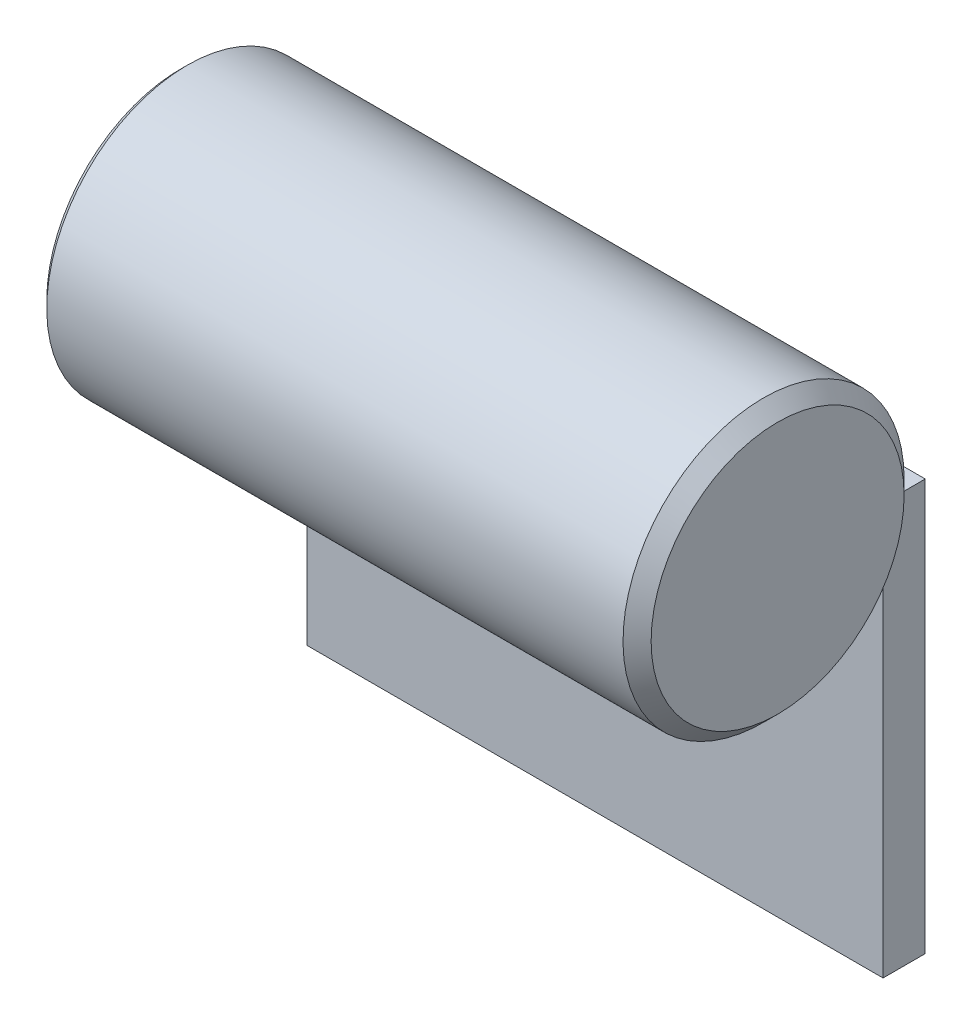
ISO-10303-21;
HEADER;
FILE_DESCRIPTION(('STEP AP214'),'2;1');
FILE_NAME('part.step','',(''),(''),'','','');
FILE_SCHEMA(('AUTOMOTIVE_DESIGN { 1 0 10303 214 1 1 1 1 }'));
ENDSEC;
DATA;
#1=APPLICATION_CONTEXT('core data for automotive mechanical design processes');
#2=APPLICATION_PROTOCOL_DEFINITION('international standard','automotive_design',2000,#1);
#3=PRODUCT_CONTEXT('',#1,'mechanical');
#4=PRODUCT('Part','Part','',(#3));
#5=PRODUCT_RELATED_PRODUCT_CATEGORY('part','',(#4));
#6=PRODUCT_DEFINITION_FORMATION('','',#4);
#7=PRODUCT_DEFINITION_CONTEXT('part definition',#1,'design');
#8=PRODUCT_DEFINITION('design','',#6,#7);
#9=PRODUCT_DEFINITION_SHAPE('','',#8);
#10=(LENGTH_UNIT() NAMED_UNIT(*) SI_UNIT(.MILLI.,.METRE.));
#11=(NAMED_UNIT(*) PLANE_ANGLE_UNIT() SI_UNIT($,.RADIAN.));
#12=(NAMED_UNIT(*) SI_UNIT($,.STERADIAN.) SOLID_ANGLE_UNIT());
#13=UNCERTAINTY_MEASURE_WITH_UNIT(LENGTH_MEASURE(1.E-05),#10,'distance_accuracy_value','');
#14=(GEOMETRIC_REPRESENTATION_CONTEXT(3) GLOBAL_UNCERTAINTY_ASSIGNED_CONTEXT((#13)) GLOBAL_UNIT_ASSIGNED_CONTEXT((#10,
#11,#12)) REPRESENTATION_CONTEXT('',''));
#15=CARTESIAN_POINT('',(0.,0.,0.));
#16=DIRECTION('',(0.,0.,1.));
#17=DIRECTION('',(1.,0.,0.));
#18=AXIS2_PLACEMENT_3D('',#15,#16,#17);
#19=CARTESIAN_POINT('',(90.6528747196546,-60.,-23.0049280207155));
#20=DIRECTION('',(0.,0.,-1.));
#21=DIRECTION('',(-1.,0.,0.));
#22=AXIS2_PLACEMENT_3D('',#19,#20,#21);
#23=PLANE('',#22);
#24=DIRECTION('',(0.,1.,0.));
#25=VECTOR('',#24,1.);
#26=CARTESIAN_POINT('',(8.6528747196546,-60.,-23.0049280207155));
#27=LINE('',#26,#25);
#28=CARTESIAN_POINT('',(8.6528747196546,-60.,-23.0049280207155));
#29=VERTEX_POINT('',#28);
#30=CARTESIAN_POINT('',(8.6528747196546,-1.5,-23.0049280207155));
#31=VERTEX_POINT('',#30);
#32=EDGE_CURVE('E134',#29,#31,#27,.T.);
#33=ORIENTED_EDGE('',*,*,#32,.T.);
#34=DIRECTION('',(-1.,0.,0.));
#35=VECTOR('',#34,1.);
#36=CARTESIAN_POINT('',(8.6528747196546,-1.5,-23.0049280207155));
#37=LINE('',#36,#35);
#38=CARTESIAN_POINT('',(90.6528747196546,-1.5,-23.0049280207155));
#39=VERTEX_POINT('',#38);
#40=EDGE_CURVE('E106',#39,#31,#37,.T.);
#41=ORIENTED_EDGE('',*,*,#40,.F.);
#42=DIRECTION('',(0.,1.,0.));
#43=VECTOR('',#42,1.);
#44=CARTESIAN_POINT('',(90.6528747196546,-60.,-23.0049280207155));
#45=LINE('',#44,#43);
#46=CARTESIAN_POINT('',(90.6528747196546,-60.,-23.0049280207155));
#47=VERTEX_POINT('',#46);
#48=EDGE_CURVE('E128',#47,#39,#45,.T.);
#49=ORIENTED_EDGE('',*,*,#48,.F.);
#50=DIRECTION('',(-1.,0.,0.));
#51=VECTOR('',#50,1.);
#52=CARTESIAN_POINT('',(90.6528747196546,-60.,-23.0049280207155));
#53=LINE('',#52,#51);
#54=EDGE_CURVE('E119',#47,#29,#53,.T.);
#55=ORIENTED_EDGE('',*,*,#54,.T.);
#56=EDGE_LOOP('',(#33,#41,#49,#55));
#57=FACE_BOUND('',#56,.T.);
#58=ADVANCED_FACE('F35',(#57),#23,.T.);
#59=CARTESIAN_POINT('',(92.6528747196546,0.,0.));
#60=DIRECTION('',(1.,0.,0.));
#61=DIRECTION('',(0.,0.,-1.));
#62=AXIS2_PLACEMENT_3D('',#59,#60,#61);
#63=PLANE('',#62);
#64=CARTESIAN_POINT('',(92.6528747196546,0.,0.));
#65=DIRECTION('',(1.,0.,0.));
#66=DIRECTION('',(0.,0.,-1.));
#67=AXIS2_PLACEMENT_3D('',#64,#65,#66);
#68=CIRCLE('',#67,18.);
#69=CARTESIAN_POINT('',(92.6528747196546,0.,-18.));
#70=VERTEX_POINT('',#69);
#71=EDGE_CURVE('E43',#70,#70,#68,.T.);
#72=ORIENTED_EDGE('',*,*,#71,.T.);
#73=EDGE_LOOP('',(#72));
#74=FACE_BOUND('',#73,.T.);
#75=ADVANCED_FACE('F37',(#74),#63,.T.);
#76=CARTESIAN_POINT('',(92.6528747196546,0.,0.));
#77=DIRECTION('',(-1.,0.,0.));
#78=DIRECTION('',(0.,0.,1.));
#79=AXIS2_PLACEMENT_3D('',#76,#77,#78);
#80=CONICAL_SURFACE('',#79,18.,0.785398163397452);
#81=CARTESIAN_POINT('',(90.6528747196546,0.,0.));
#82=DIRECTION('',(1.,0.,0.));
#83=DIRECTION('',(0.,0.,-1.));
#84=AXIS2_PLACEMENT_3D('',#81,#82,#83);
#85=CIRCLE('',#84,20.);
#86=CARTESIAN_POINT('',(90.6528747196546,0.,-20.));
#87=VERTEX_POINT('',#86);
#88=CARTESIAN_POINT('',(90.6528747196546,-10.5296960307727,-17.0036908199229));
#89=VERTEX_POINT('',#88);
#90=EDGE_CURVE('E157',#87,#89,#85,.T.);
#91=ORIENTED_EDGE('',*,*,#90,.T.);
#92=EDGE_CURVE('E156',#89,#87,#85,.T.);
#93=ORIENTED_EDGE('',*,*,#92,.T.);
#94=EDGE_LOOP('',(#91,#93));
#95=FACE_BOUND('',#94,.T.);
#96=ORIENTED_EDGE('',*,*,#71,.F.);
#97=EDGE_LOOP('',(#96));
#98=FACE_BOUND('',#97,.T.);
#99=ADVANCED_FACE('F162',(#95,#98),#80,.T.);
#100=CARTESIAN_POINT('',(102.994030823935,0.,0.));
#101=DIRECTION('',(1.,0.,0.));
#102=DIRECTION('',(0.,0.,-1.));
#103=AXIS2_PLACEMENT_3D('',#100,#101,#102);
#104=CYLINDRICAL_SURFACE('',#103,20.);
#105=DIRECTION('',(1.,0.,0.));
#106=VECTOR('',#105,1.);
#107=CARTESIAN_POINT('',(102.994030823935,-10.5296960307727,-17.0036908199229));
#108=LINE('',#107,#106);
#109=CARTESIAN_POINT('',(8.6528747196546,-10.5296960307726,-17.0036908199229));
#110=VERTEX_POINT('',#109);
#111=EDGE_CURVE('E50',#89,#110,#108,.F.);
#112=ORIENTED_EDGE('',*,*,#111,.F.);
#113=ORIENTED_EDGE('',*,*,#90,.F.);
#114=DIRECTION('',(1.,0.,0.));
#115=VECTOR('',#114,1.);
#116=CARTESIAN_POINT('',(102.994030823935,0.,-20.));
#117=LINE('',#116,#115);
#118=CARTESIAN_POINT('',(8.6528747196546,0.,-20.));
#119=VERTEX_POINT('',#118);
#120=EDGE_CURVE('E11',#119,#87,#117,.T.);
#121=ORIENTED_EDGE('',*,*,#120,.F.);
#122=CARTESIAN_POINT('',(8.6528747196546,0.,0.));
#123=DIRECTION('',(1.,0.,0.));
#124=DIRECTION('',(0.,0.,-1.));
#125=AXIS2_PLACEMENT_3D('',#122,#123,#124);
#126=CIRCLE('',#125,20.);
#127=EDGE_CURVE('E154',#119,#110,#126,.T.);
#128=ORIENTED_EDGE('',*,*,#127,.T.);
#129=EDGE_LOOP('',(#112,#113,#121,#128));
#130=FACE_BOUND('',#129,.T.);
#131=ADVANCED_FACE('F164',(#130),#104,.T.);
#132=CARTESIAN_POINT('',(8.6528747196546,0.,0.));
#133=DIRECTION('',(1.,0.,0.));
#134=DIRECTION('',(0.,0.,-1.));
#135=AXIS2_PLACEMENT_3D('',#132,#133,#134);
#136=CONICAL_SURFACE('',#135,20.,0.785398163397452);
#137=CARTESIAN_POINT('',(7.6528747196546,0.,0.));
#138=DIRECTION('',(1.,0.,0.));
#139=DIRECTION('',(0.,0.,-1.));
#140=AXIS2_PLACEMENT_3D('',#137,#138,#139);
#141=CIRCLE('',#140,19.);
#142=CARTESIAN_POINT('',(7.6528747196546,0.,-19.));
#143=VERTEX_POINT('',#142);
#144=EDGE_CURVE('E151',#143,#143,#141,.T.);
#145=ORIENTED_EDGE('',*,*,#144,.T.);
#146=EDGE_LOOP('',(#145));
#147=FACE_BOUND('',#146,.T.);
#148=ORIENTED_EDGE('',*,*,#127,.F.);
#149=EDGE_CURVE('E57',#110,#119,#126,.T.);
#150=ORIENTED_EDGE('',*,*,#149,.F.);
#151=EDGE_LOOP('',(#148,#150));
#152=FACE_BOUND('',#151,.T.);
#153=ADVANCED_FACE('F170',(#147,#152),#136,.T.);
#154=CARTESIAN_POINT('',(7.6528747196546,0.,-19.));
#155=DIRECTION('',(-1.,0.,0.));
#156=DIRECTION('',(0.,0.,1.));
#157=AXIS2_PLACEMENT_3D('',#154,#155,#156);
#158=PLANE('',#157);
#159=CARTESIAN_POINT('',(7.6528747196546,0.,0.));
#160=DIRECTION('',(1.,0.,0.));
#161=DIRECTION('',(0.,0.,-1.));
#162=AXIS2_PLACEMENT_3D('',#159,#160,#161);
#163=CIRCLE('',#162,14.7500466259145);
#164=CARTESIAN_POINT('',(7.6528747196546,0.,-14.7500466259145));
#165=VERTEX_POINT('',#164);
#166=EDGE_CURVE('E148',#165,#165,#163,.T.);
#167=ORIENTED_EDGE('',*,*,#166,.T.);
#168=EDGE_LOOP('',(#167));
#169=FACE_BOUND('',#168,.T.);
#170=ORIENTED_EDGE('',*,*,#144,.F.);
#171=EDGE_LOOP('',(#170));
#172=FACE_BOUND('',#171,.T.);
#173=ADVANCED_FACE('F200',(#169,#172),#158,.T.);
#174=CARTESIAN_POINT('',(7.6528747196546,0.,0.));
#175=DIRECTION('',(-1.,0.,0.));
#176=DIRECTION('',(0.,0.,1.));
#177=AXIS2_PLACEMENT_3D('',#174,#175,#176);
#178=CONICAL_SURFACE('',#177,14.7500466259145,0.785398163397448);
#179=CARTESIAN_POINT('',(8.6528747196546,0.,0.));
#180=DIRECTION('',(1.,0.,0.));
#181=DIRECTION('',(0.,0.,-1.));
#182=AXIS2_PLACEMENT_3D('',#179,#180,#181);
#183=CIRCLE('',#182,13.7500466259145);
#184=CARTESIAN_POINT('',(8.6528747196546,0.,-13.7500466259145));
#185=VERTEX_POINT('',#184);
#186=EDGE_CURVE('E145',#185,#185,#183,.T.);
#187=ORIENTED_EDGE('',*,*,#186,.T.);
#188=EDGE_LOOP('',(#187));
#189=FACE_BOUND('',#188,.T.);
#190=ORIENTED_EDGE('',*,*,#166,.F.);
#191=EDGE_LOOP('',(#190));
#192=FACE_BOUND('',#191,.T.);
#193=ADVANCED_FACE('F196',(#189,#192),#178,.F.);
#194=CARTESIAN_POINT('',(102.994030823935,0.,0.));
#195=DIRECTION('',(1.,0.,0.));
#196=DIRECTION('',(0.,0.,-1.));
#197=AXIS2_PLACEMENT_3D('',#194,#195,#196);
#198=CYLINDRICAL_SURFACE('',#197,13.7500466259145);
#199=CARTESIAN_POINT('',(71.6294297140758,0.,0.));
#200=DIRECTION('',(1.,0.,0.));
#201=DIRECTION('',(0.,0.,-1.));
#202=AXIS2_PLACEMENT_3D('',#199,#200,#201);
#203=CIRCLE('',#202,13.7500466259145);
#204=CARTESIAN_POINT('',(71.6294297140758,0.,-13.7500466259145));
#205=VERTEX_POINT('',#204);
#206=EDGE_CURVE('E142',#205,#205,#203,.T.);
#207=ORIENTED_EDGE('',*,*,#206,.T.);
#208=EDGE_LOOP('',(#207));
#209=FACE_BOUND('',#208,.T.);
#210=ORIENTED_EDGE('',*,*,#186,.F.);
#211=EDGE_LOOP('',(#210));
#212=FACE_BOUND('',#211,.T.);
#213=ADVANCED_FACE('F192',(#209,#212),#198,.F.);
#214=CARTESIAN_POINT('',(71.6294297140758,0.,-3.43020549685093));
#215=DIRECTION('',(-1.,0.,0.));
#216=DIRECTION('',(0.,0.,1.));
#217=AXIS2_PLACEMENT_3D('',#214,#215,#216);
#218=PLANE('',#217);
#219=CARTESIAN_POINT('',(71.6294297140758,0.,0.));
#220=DIRECTION('',(1.,0.,0.));
#221=DIRECTION('',(0.,0.,-1.));
#222=AXIS2_PLACEMENT_3D('',#219,#220,#221);
#223=CIRCLE('',#222,3.43020549685093);
#224=CARTESIAN_POINT('',(71.6294297140758,0.,-3.43020549685093));
#225=VERTEX_POINT('',#224);
#226=EDGE_CURVE('E139',#225,#225,#223,.T.);
#227=ORIENTED_EDGE('',*,*,#226,.T.);
#228=EDGE_LOOP('',(#227));
#229=FACE_BOUND('',#228,.T.);
#230=ORIENTED_EDGE('',*,*,#206,.F.);
#231=EDGE_LOOP('',(#230));
#232=FACE_BOUND('',#231,.T.);
#233=ADVANCED_FACE('F188',(#229,#232),#218,.T.);
#234=CARTESIAN_POINT('',(71.6294297140758,0.,0.));
#235=DIRECTION('',(-1.,0.,0.));
#236=DIRECTION('',(0.,0.,1.));
#237=AXIS2_PLACEMENT_3D('',#234,#235,#236);
#238=CONICAL_SURFACE('',#237,3.43020549685093,0.585875576414255);
#239=CARTESIAN_POINT('',(76.7985263485862,0.,0.));
#240=VERTEX_POINT('',#239);
#241=VERTEX_LOOP('',#240);
#242=FACE_BOUND('',#241,.T.);
#243=ORIENTED_EDGE('',*,*,#226,.F.);
#244=EDGE_LOOP('',(#243));
#245=FACE_BOUND('',#244,.T.);
#246=ADVANCED_FACE('F185',(#242,#245),#238,.F.);
#247=CARTESIAN_POINT('',(90.6528747196546,-60.,-17.0036908199229));
#248=DIRECTION('',(1.,0.,0.));
#249=DIRECTION('',(0.,0.,-1.));
#250=AXIS2_PLACEMENT_3D('',#247,#248,#249);
#251=PLANE('',#250);
#252=DIRECTION('',(0.,1.,0.));
#253=VECTOR('',#252,1.);
#254=CARTESIAN_POINT('',(90.6528747196546,-1.5,-20.));
#255=LINE('',#254,#253);
#256=CARTESIAN_POINT('',(90.6528747196546,-1.5,-20.));
#257=VERTEX_POINT('',#256);
#258=EDGE_CURVE('E97',#257,#87,#255,.T.);
#259=ORIENTED_EDGE('',*,*,#258,.T.);
#260=ORIENTED_EDGE('',*,*,#92,.F.);
#261=DIRECTION('',(0.,1.,0.));
#262=VECTOR('',#261,1.);
#263=CARTESIAN_POINT('',(90.6528747196546,-60.,-17.0036908199229));
#264=LINE('',#263,#262);
#265=CARTESIAN_POINT('',(90.6528747196546,-60.,-17.0036908199229));
#266=VERTEX_POINT('',#265);
#267=EDGE_CURVE('E129',#266,#89,#264,.T.);
#268=ORIENTED_EDGE('',*,*,#267,.F.);
#269=DIRECTION('',(0.,0.,-1.));
#270=VECTOR('',#269,1.);
#271=CARTESIAN_POINT('',(90.6528747196546,-60.,-17.0036908199229));
#272=LINE('',#271,#270);
#273=EDGE_CURVE('E113',#266,#47,#272,.T.);
#274=ORIENTED_EDGE('',*,*,#273,.T.);
#275=ORIENTED_EDGE('',*,*,#48,.T.);
#276=DIRECTION('',(0.,0.,-1.));
#277=VECTOR('',#276,1.);
#278=CARTESIAN_POINT('',(90.6528747196546,-1.5,-23.0049280207155));
#279=LINE('',#278,#277);
#280=EDGE_CURVE('E100',#257,#39,#279,.T.);
#281=ORIENTED_EDGE('',*,*,#280,.F.);
#282=EDGE_LOOP('',(#259,#260,#268,#274,#275,#281));
#283=FACE_BOUND('',#282,.T.);
#284=ADVANCED_FACE('F182',(#283),#251,.T.);
#285=CARTESIAN_POINT('',(90.6528747196546,-60.,-17.0036908199229));
#286=DIRECTION('',(0.,0.,1.));
#287=DIRECTION('',(1.,0.,0.));
#288=AXIS2_PLACEMENT_3D('',#285,#286,#287);
#289=PLANE('',#288);
#290=ORIENTED_EDGE('',*,*,#267,.T.);
#291=ORIENTED_EDGE('',*,*,#111,.T.);
#292=DIRECTION('',(0.,1.,0.));
#293=VECTOR('',#292,1.);
#294=CARTESIAN_POINT('',(8.6528747196546,-60.,-17.0036908199229));
#295=LINE('',#294,#293);
#296=CARTESIAN_POINT('',(8.6528747196546,-60.,-17.0036908199229));
#297=VERTEX_POINT('',#296);
#298=EDGE_CURVE('E132',#297,#110,#295,.T.);
#299=ORIENTED_EDGE('',*,*,#298,.F.);
#300=DIRECTION('',(1.,0.,0.));
#301=VECTOR('',#300,1.);
#302=CARTESIAN_POINT('',(90.6528747196546,-60.,-17.0036908199229));
#303=LINE('',#302,#301);
#304=EDGE_CURVE('E125',#297,#266,#303,.T.);
#305=ORIENTED_EDGE('',*,*,#304,.T.);
#306=EDGE_LOOP('',(#290,#291,#299,#305));
#307=FACE_BOUND('',#306,.T.);
#308=ADVANCED_FACE('F184',(#307),#289,.T.);
#309=CARTESIAN_POINT('',(8.6528747196546,-60.,-17.0036908199229));
#310=DIRECTION('',(-1.,0.,0.));
#311=DIRECTION('',(0.,0.,1.));
#312=AXIS2_PLACEMENT_3D('',#309,#310,#311);
#313=PLANE('',#312);
#314=DIRECTION('',(0.,1.,0.));
#315=VECTOR('',#314,1.);
#316=CARTESIAN_POINT('',(8.6528747196546,-1.5,-20.));
#317=LINE('',#316,#315);
#318=CARTESIAN_POINT('',(8.6528747196546,-1.5,-20.));
#319=VERTEX_POINT('',#318);
#320=EDGE_CURVE('E95',#319,#119,#317,.T.);
#321=ORIENTED_EDGE('',*,*,#320,.F.);
#322=DIRECTION('',(0.,0.,1.));
#323=VECTOR('',#322,1.);
#324=CARTESIAN_POINT('',(8.6528747196546,-1.5,-23.0049280207155));
#325=LINE('',#324,#323);
#326=EDGE_CURVE('E101',#31,#319,#325,.T.);
#327=ORIENTED_EDGE('',*,*,#326,.F.);
#328=ORIENTED_EDGE('',*,*,#32,.F.);
#329=DIRECTION('',(0.,0.,1.));
#330=VECTOR('',#329,1.);
#331=CARTESIAN_POINT('',(8.6528747196546,-60.,-17.0036908199229));
#332=LINE('',#331,#330);
#333=EDGE_CURVE('E122',#29,#297,#332,.T.);
#334=ORIENTED_EDGE('',*,*,#333,.T.);
#335=ORIENTED_EDGE('',*,*,#298,.T.);
#336=ORIENTED_EDGE('',*,*,#149,.T.);
#337=EDGE_LOOP('',(#321,#327,#328,#334,#335,#336));
#338=FACE_BOUND('',#337,.T.);
#339=ADVANCED_FACE('F110',(#338),#313,.T.);
#340=CARTESIAN_POINT('',(0.,-60.,0.));
#341=DIRECTION('',(0.,1.,0.));
#342=DIRECTION('',(0.,0.,1.));
#343=AXIS2_PLACEMENT_3D('',#340,#341,#342);
#344=PLANE('',#343);
#345=ORIENTED_EDGE('',*,*,#273,.F.);
#346=ORIENTED_EDGE('',*,*,#304,.F.);
#347=ORIENTED_EDGE('',*,*,#333,.F.);
#348=ORIENTED_EDGE('',*,*,#54,.F.);
#349=EDGE_LOOP('',(#345,#346,#347,#348));
#350=FACE_BOUND('',#349,.T.);
#351=ADVANCED_FACE('F220',(#350),#344,.F.);
#352=CARTESIAN_POINT('',(8.6528747196546,-1.5,-20.));
#353=DIRECTION('',(0.,0.,1.));
#354=DIRECTION('',(1.,0.,0.));
#355=AXIS2_PLACEMENT_3D('',#352,#353,#354);
#356=PLANE('',#355);
#357=ORIENTED_EDGE('',*,*,#120,.T.);
#358=ORIENTED_EDGE('',*,*,#258,.F.);
#359=DIRECTION('',(1.,0.,0.));
#360=VECTOR('',#359,1.);
#361=CARTESIAN_POINT('',(8.6528747196546,-1.5,-20.));
#362=LINE('',#361,#360);
#363=EDGE_CURVE('E91',#319,#257,#362,.T.);
#364=ORIENTED_EDGE('',*,*,#363,.F.);
#365=ORIENTED_EDGE('',*,*,#320,.T.);
#366=EDGE_LOOP('',(#357,#358,#364,#365));
#367=FACE_BOUND('',#366,.T.);
#368=ADVANCED_FACE('F93',(#367),#356,.F.);
#369=CARTESIAN_POINT('',(0.,-1.5,0.));
#370=DIRECTION('',(0.,1.,0.));
#371=DIRECTION('',(0.,0.,1.));
#372=AXIS2_PLACEMENT_3D('',#369,#370,#371);
#373=PLANE('',#372);
#374=ORIENTED_EDGE('',*,*,#326,.T.);
#375=ORIENTED_EDGE('',*,*,#363,.T.);
#376=ORIENTED_EDGE('',*,*,#280,.T.);
#377=ORIENTED_EDGE('',*,*,#40,.T.);
#378=EDGE_LOOP('',(#374,#375,#376,#377));
#379=FACE_BOUND('',#378,.T.);
#380=ADVANCED_FACE('F104',(#379),#373,.T.);
#381=CLOSED_SHELL('',(#58,#75,#99,#131,#153,#173,#193,#213,#233,#246,#284,#308,#339,#351,#368,#380));
#382=MANIFOLD_SOLID_BREP('B2',#381);
#383=ADVANCED_BREP_SHAPE_REPRESENTATION('',(#18,#382),#14);
#384=SHAPE_DEFINITION_REPRESENTATION(#9,#383);
ENDSEC;
END-ISO-10303-21;
